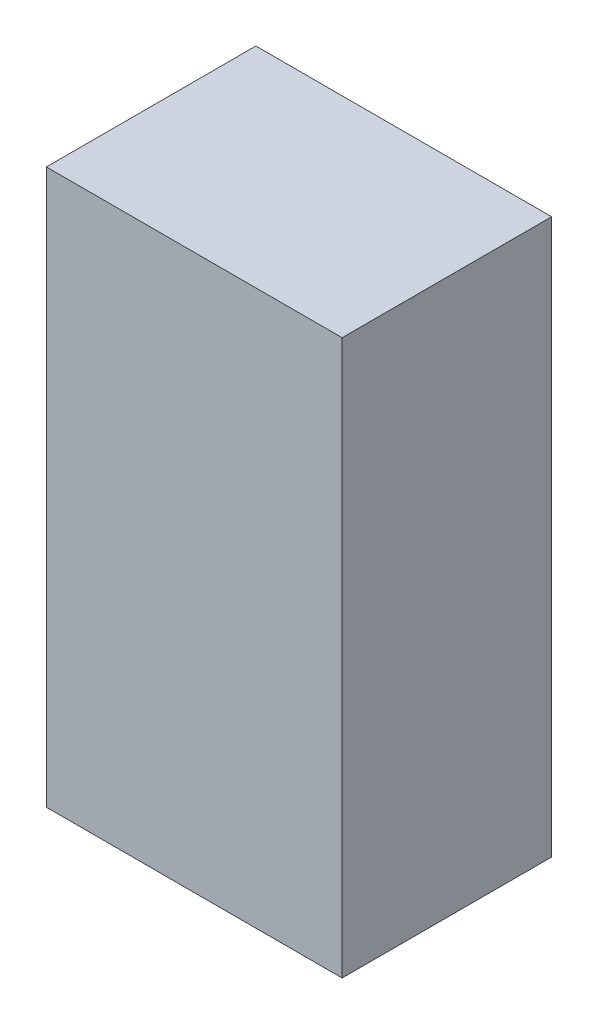
ISO-10303-21;
HEADER;
FILE_DESCRIPTION(('STEP AP214'),'2;1');
FILE_NAME('part.step','',(''),(''),'','','');
FILE_SCHEMA(('AUTOMOTIVE_DESIGN { 1 0 10303 214 1 1 1 1 }'));
ENDSEC;
DATA;
#1=APPLICATION_CONTEXT('core data for automotive mechanical design processes');
#2=APPLICATION_PROTOCOL_DEFINITION('international standard','automotive_design',2000,#1);
#3=PRODUCT_CONTEXT('',#1,'mechanical');
#4=PRODUCT('Part','Part','',(#3));
#5=PRODUCT_RELATED_PRODUCT_CATEGORY('part','',(#4));
#6=PRODUCT_DEFINITION_FORMATION('','',#4);
#7=PRODUCT_DEFINITION_CONTEXT('part definition',#1,'design');
#8=PRODUCT_DEFINITION('design','',#6,#7);
#9=PRODUCT_DEFINITION_SHAPE('','',#8);
#10=(LENGTH_UNIT() NAMED_UNIT(*) SI_UNIT(.MILLI.,.METRE.));
#11=(NAMED_UNIT(*) PLANE_ANGLE_UNIT() SI_UNIT($,.RADIAN.));
#12=(NAMED_UNIT(*) SI_UNIT($,.STERADIAN.) SOLID_ANGLE_UNIT());
#13=UNCERTAINTY_MEASURE_WITH_UNIT(LENGTH_MEASURE(1.E-05),#10,'distance_accuracy_value','');
#14=(GEOMETRIC_REPRESENTATION_CONTEXT(3) GLOBAL_UNCERTAINTY_ASSIGNED_CONTEXT((#13)) GLOBAL_UNIT_ASSIGNED_CONTEXT((#10,
#11,#12)) REPRESENTATION_CONTEXT('',''));
#15=CARTESIAN_POINT('',(0.,0.,0.));
#16=DIRECTION('',(0.,0.,1.));
#17=DIRECTION('',(1.,0.,0.));
#18=AXIS2_PLACEMENT_3D('',#15,#16,#17);
#19=CARTESIAN_POINT('',(-60.,-112.5,85.));
#20=DIRECTION('',(1.,0.,0.));
#21=DIRECTION('',(0.,0.,-1.));
#22=AXIS2_PLACEMENT_3D('',#19,#20,#21);
#23=PLANE('',#22);
#24=DIRECTION('',(0.,-1.,0.));
#25=VECTOR('',#24,1.);
#26=CARTESIAN_POINT('',(-60.,-112.5,0.));
#27=LINE('',#26,#25);
#28=CARTESIAN_POINT('',(-60.,112.5,0.));
#29=VERTEX_POINT('',#28);
#30=CARTESIAN_POINT('',(-60.,-112.5,0.));
#31=VERTEX_POINT('',#30);
#32=EDGE_CURVE('E97',#29,#31,#27,.T.);
#33=ORIENTED_EDGE('',*,*,#32,.T.);
#34=DIRECTION('',(0.,0.,-1.));
#35=VECTOR('',#34,1.);
#36=CARTESIAN_POINT('',(-60.,-112.5,85.));
#37=LINE('',#36,#35);
#38=CARTESIAN_POINT('',(-60.,-112.5,85.));
#39=VERTEX_POINT('',#38);
#40=EDGE_CURVE('E11',#39,#31,#37,.T.);
#41=ORIENTED_EDGE('',*,*,#40,.F.);
#42=DIRECTION('',(0.,-1.,0.));
#43=VECTOR('',#42,1.);
#44=CARTESIAN_POINT('',(-60.,-112.5,85.));
#45=LINE('',#44,#43);
#46=CARTESIAN_POINT('',(-60.,112.5,85.));
#47=VERTEX_POINT('',#46);
#48=EDGE_CURVE('E85',#47,#39,#45,.T.);
#49=ORIENTED_EDGE('',*,*,#48,.F.);
#50=DIRECTION('',(0.,0.,-1.));
#51=VECTOR('',#50,1.);
#52=CARTESIAN_POINT('',(-60.,112.5,85.));
#53=LINE('',#52,#51);
#54=EDGE_CURVE('E93',#47,#29,#53,.T.);
#55=ORIENTED_EDGE('',*,*,#54,.T.);
#56=EDGE_LOOP('',(#33,#41,#49,#55));
#57=FACE_BOUND('',#56,.T.);
#58=ADVANCED_FACE('F34',(#57),#23,.F.);
#59=CARTESIAN_POINT('',(60.,-112.5,85.));
#60=DIRECTION('',(0.,1.,0.));
#61=DIRECTION('',(-1.,0.,0.));
#62=AXIS2_PLACEMENT_3D('',#59,#60,#61);
#63=PLANE('',#62);
#64=DIRECTION('',(1.,0.,0.));
#65=VECTOR('',#64,1.);
#66=CARTESIAN_POINT('',(60.,-112.5,0.));
#67=LINE('',#66,#65);
#68=CARTESIAN_POINT('',(60.,-112.5,0.));
#69=VERTEX_POINT('',#68);
#70=EDGE_CURVE('E89',#31,#69,#67,.T.);
#71=ORIENTED_EDGE('',*,*,#70,.T.);
#72=DIRECTION('',(0.,0.,-1.));
#73=VECTOR('',#72,1.);
#74=CARTESIAN_POINT('',(60.,-112.5,85.));
#75=LINE('',#74,#73);
#76=CARTESIAN_POINT('',(60.,-112.5,85.));
#77=VERTEX_POINT('',#76);
#78=EDGE_CURVE('E42',#77,#69,#75,.T.);
#79=ORIENTED_EDGE('',*,*,#78,.F.);
#80=DIRECTION('',(1.,0.,0.));
#81=VECTOR('',#80,1.);
#82=CARTESIAN_POINT('',(60.,-112.5,85.));
#83=LINE('',#82,#81);
#84=EDGE_CURVE('E80',#39,#77,#83,.T.);
#85=ORIENTED_EDGE('',*,*,#84,.F.);
#86=ORIENTED_EDGE('',*,*,#40,.T.);
#87=EDGE_LOOP('',(#71,#79,#85,#86));
#88=FACE_BOUND('',#87,.T.);
#89=ADVANCED_FACE('F88',(#88),#63,.F.);
#90=CARTESIAN_POINT('',(60.,-112.5,85.));
#91=DIRECTION('',(-1.,0.,0.));
#92=DIRECTION('',(0.,0.,1.));
#93=AXIS2_PLACEMENT_3D('',#90,#91,#92);
#94=PLANE('',#93);
#95=DIRECTION('',(0.,1.,0.));
#96=VECTOR('',#95,1.);
#97=CARTESIAN_POINT('',(60.,-112.5,0.));
#98=LINE('',#97,#96);
#99=CARTESIAN_POINT('',(60.,112.5,0.));
#100=VERTEX_POINT('',#99);
#101=EDGE_CURVE('E67',#69,#100,#98,.T.);
#102=ORIENTED_EDGE('',*,*,#101,.T.);
#103=DIRECTION('',(0.,0.,-1.));
#104=VECTOR('',#103,1.);
#105=CARTESIAN_POINT('',(60.,112.5,85.));
#106=LINE('',#105,#104);
#107=CARTESIAN_POINT('',(60.,112.5,85.));
#108=VERTEX_POINT('',#107);
#109=EDGE_CURVE('E90',#108,#100,#106,.T.);
#110=ORIENTED_EDGE('',*,*,#109,.F.);
#111=DIRECTION('',(0.,1.,0.));
#112=VECTOR('',#111,1.);
#113=CARTESIAN_POINT('',(60.,-112.5,85.));
#114=LINE('',#113,#112);
#115=EDGE_CURVE('E83',#77,#108,#114,.T.);
#116=ORIENTED_EDGE('',*,*,#115,.F.);
#117=ORIENTED_EDGE('',*,*,#78,.T.);
#118=EDGE_LOOP('',(#102,#110,#116,#117));
#119=FACE_BOUND('',#118,.T.);
#120=ADVANCED_FACE('F91',(#119),#94,.F.);
#121=CARTESIAN_POINT('',(60.,112.5,85.));
#122=DIRECTION('',(0.,-1.,0.));
#123=DIRECTION('',(0.,0.,-1.));
#124=AXIS2_PLACEMENT_3D('',#121,#122,#123);
#125=PLANE('',#124);
#126=DIRECTION('',(-1.,0.,0.));
#127=VECTOR('',#126,1.);
#128=CARTESIAN_POINT('',(60.,112.5,0.));
#129=LINE('',#128,#127);
#130=EDGE_CURVE('E73',#100,#29,#129,.T.);
#131=ORIENTED_EDGE('',*,*,#130,.T.);
#132=ORIENTED_EDGE('',*,*,#54,.F.);
#133=DIRECTION('',(-1.,0.,0.));
#134=VECTOR('',#133,1.);
#135=CARTESIAN_POINT('',(60.,112.5,85.));
#136=LINE('',#135,#134);
#137=EDGE_CURVE('E50',#108,#47,#136,.T.);
#138=ORIENTED_EDGE('',*,*,#137,.F.);
#139=ORIENTED_EDGE('',*,*,#109,.T.);
#140=EDGE_LOOP('',(#131,#132,#138,#139));
#141=FACE_BOUND('',#140,.T.);
#142=ADVANCED_FACE('F104',(#141),#125,.F.);
#143=CARTESIAN_POINT('',(0.,0.,85.));
#144=DIRECTION('',(0.,0.,1.));
#145=DIRECTION('',(1.,0.,0.));
#146=AXIS2_PLACEMENT_3D('',#143,#144,#145);
#147=PLANE('',#146);
#148=ORIENTED_EDGE('',*,*,#48,.T.);
#149=ORIENTED_EDGE('',*,*,#84,.T.);
#150=ORIENTED_EDGE('',*,*,#115,.T.);
#151=ORIENTED_EDGE('',*,*,#137,.T.);
#152=EDGE_LOOP('',(#148,#149,#150,#151));
#153=FACE_BOUND('',#152,.T.);
#154=ADVANCED_FACE('F81',(#153),#147,.T.);
#155=CARTESIAN_POINT('',(0.,0.,0.));
#156=DIRECTION('',(0.,0.,1.));
#157=DIRECTION('',(1.,0.,0.));
#158=AXIS2_PLACEMENT_3D('',#155,#156,#157);
#159=PLANE('',#158);
#160=ORIENTED_EDGE('',*,*,#32,.F.);
#161=ORIENTED_EDGE('',*,*,#130,.F.);
#162=ORIENTED_EDGE('',*,*,#101,.F.);
#163=ORIENTED_EDGE('',*,*,#70,.F.);
#164=EDGE_LOOP('',(#160,#161,#162,#163));
#165=FACE_BOUND('',#164,.T.);
#166=ADVANCED_FACE('F107',(#165),#159,.F.);
#167=CLOSED_SHELL('',(#58,#89,#120,#142,#154,#166));
#168=MANIFOLD_SOLID_BREP('B2',#167);
#169=ADVANCED_BREP_SHAPE_REPRESENTATION('',(#18,#168),#14);
#170=SHAPE_DEFINITION_REPRESENTATION(#9,#169);
ENDSEC;
END-ISO-10303-21;
